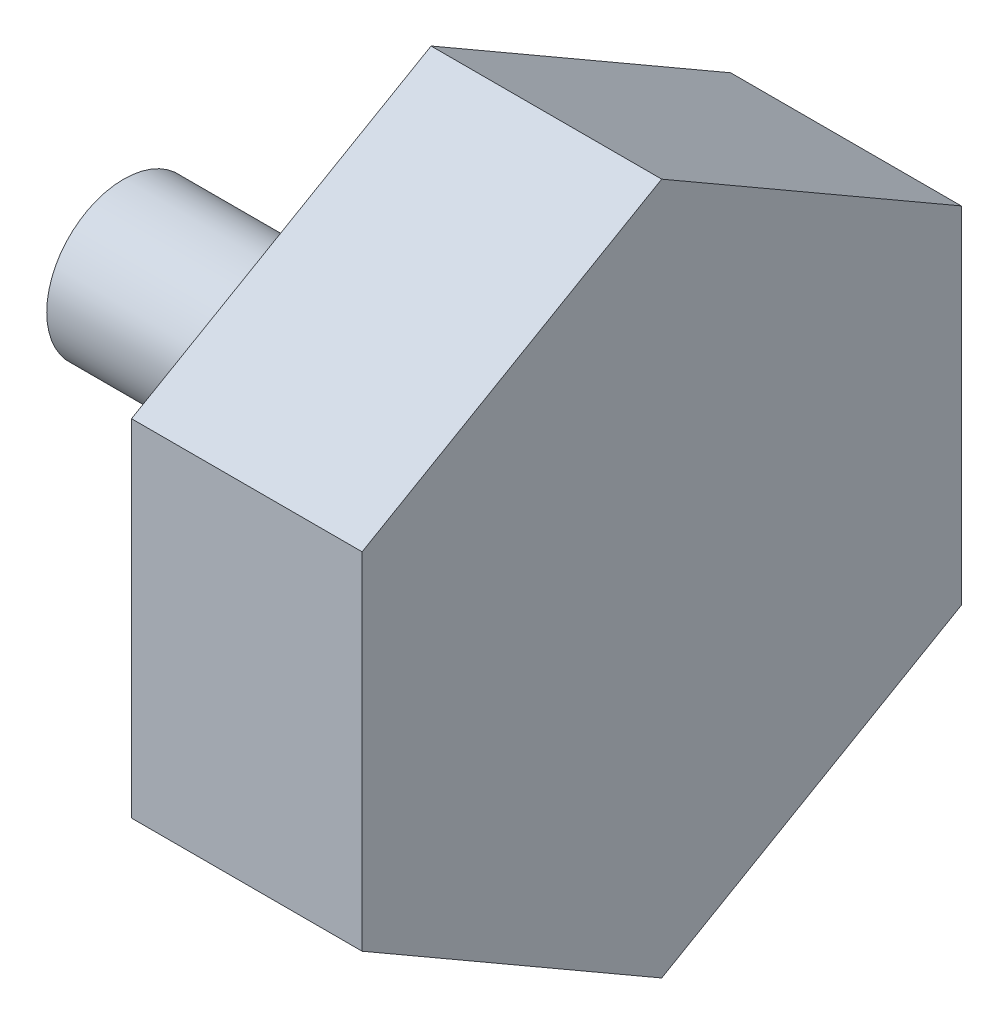
ISO-10303-21;
HEADER;
FILE_DESCRIPTION(('STEP AP214'),'2;1');
FILE_NAME('part.step','',(''),(''),'','','');
FILE_SCHEMA(('AUTOMOTIVE_DESIGN { 1 0 10303 214 1 1 1 1 }'));
ENDSEC;
DATA;
#1=APPLICATION_CONTEXT('core data for automotive mechanical design processes');
#2=APPLICATION_PROTOCOL_DEFINITION('international standard','automotive_design',2000,#1);
#3=PRODUCT_CONTEXT('',#1,'mechanical');
#4=PRODUCT('Part','Part','',(#3));
#5=PRODUCT_RELATED_PRODUCT_CATEGORY('part','',(#4));
#6=PRODUCT_DEFINITION_FORMATION('','',#4);
#7=PRODUCT_DEFINITION_CONTEXT('part definition',#1,'design');
#8=PRODUCT_DEFINITION('design','',#6,#7);
#9=PRODUCT_DEFINITION_SHAPE('','',#8);
#10=(LENGTH_UNIT() NAMED_UNIT(*) SI_UNIT(.MILLI.,.METRE.));
#11=(NAMED_UNIT(*) PLANE_ANGLE_UNIT() SI_UNIT($,.RADIAN.));
#12=(NAMED_UNIT(*) SI_UNIT($,.STERADIAN.) SOLID_ANGLE_UNIT());
#13=UNCERTAINTY_MEASURE_WITH_UNIT(LENGTH_MEASURE(1.E-05),#10,'distance_accuracy_value','');
#14=(GEOMETRIC_REPRESENTATION_CONTEXT(3) GLOBAL_UNCERTAINTY_ASSIGNED_CONTEXT((#13)) GLOBAL_UNIT_ASSIGNED_CONTEXT((#10,
#11,#12)) REPRESENTATION_CONTEXT('',''));
#15=CARTESIAN_POINT('',(0.,0.,0.));
#16=DIRECTION('',(0.,0.,1.));
#17=DIRECTION('',(1.,0.,0.));
#18=AXIS2_PLACEMENT_3D('',#15,#16,#17);
#19=CARTESIAN_POINT('',(6.,-4.50000000000008,7.79422863405988));
#20=DIRECTION('',(0.,0.866025403784442,-0.499999999999995));
#21=DIRECTION('',(0.,0.499999999999995,0.866025403784442));
#22=AXIS2_PLACEMENT_3D('',#19,#20,#21);
#23=PLANE('',#22);
#24=DIRECTION('',(0.,-0.499999999999995,-0.866025403784441));
#25=VECTOR('',#24,1.);
#26=CARTESIAN_POINT('',(0.,-4.50000000000008,7.79422863405988));
#27=LINE('',#26,#25);
#28=CARTESIAN_POINT('',(0.,-4.50000000000008,7.79422863405988));
#29=VERTEX_POINT('',#28);
#30=CARTESIAN_POINT('',(0.,-8.99999999999998,0.));
#31=VERTEX_POINT('',#30);
#32=EDGE_CURVE('E121',#29,#31,#27,.T.);
#33=ORIENTED_EDGE('',*,*,#32,.T.);
#34=DIRECTION('',(-1.,0.,0.));
#35=VECTOR('',#34,1.);
#36=CARTESIAN_POINT('',(6.,-8.99999999999998,0.));
#37=LINE('',#36,#35);
#38=CARTESIAN_POINT('',(6.,-8.99999999999998,0.));
#39=VERTEX_POINT('',#38);
#40=EDGE_CURVE('E44',#39,#31,#37,.T.);
#41=ORIENTED_EDGE('',*,*,#40,.F.);
#42=DIRECTION('',(0.,-0.499999999999995,-0.866025403784441));
#43=VECTOR('',#42,1.);
#44=CARTESIAN_POINT('',(6.,-4.50000000000008,7.79422863405988));
#45=LINE('',#44,#43);
#46=CARTESIAN_POINT('',(6.,-4.50000000000008,7.79422863405988));
#47=VERTEX_POINT('',#46);
#48=EDGE_CURVE('E132',#47,#39,#45,.T.);
#49=ORIENTED_EDGE('',*,*,#48,.F.);
#50=DIRECTION('',(-1.,0.,0.));
#51=VECTOR('',#50,1.);
#52=CARTESIAN_POINT('',(6.,-4.50000000000008,7.79422863405988));
#53=LINE('',#52,#51);
#54=EDGE_CURVE('E117',#47,#29,#53,.T.);
#55=ORIENTED_EDGE('',*,*,#54,.T.);
#56=EDGE_LOOP('',(#33,#41,#49,#55));
#57=FACE_BOUND('',#56,.T.);
#58=ADVANCED_FACE('F36',(#57),#23,.F.);
#59=CARTESIAN_POINT('',(6.,-8.99999999999998,0.));
#60=DIRECTION('',(0.,0.866025403784438,0.500000000000001));
#61=DIRECTION('',(0.,-0.500000000000001,0.866025403784438));
#62=AXIS2_PLACEMENT_3D('',#59,#60,#61);
#63=PLANE('',#62);
#64=DIRECTION('',(0.,0.500000000000001,-0.866025403784438));
#65=VECTOR('',#64,1.);
#66=CARTESIAN_POINT('',(0.,-8.99999999999998,0.));
#67=LINE('',#66,#65);
#68=CARTESIAN_POINT('',(0.,-4.49999999999997,-7.79422863405994));
#69=VERTEX_POINT('',#68);
#70=EDGE_CURVE('E124',#31,#69,#67,.T.);
#71=ORIENTED_EDGE('',*,*,#70,.T.);
#72=DIRECTION('',(-1.,0.,0.));
#73=VECTOR('',#72,1.);
#74=CARTESIAN_POINT('',(6.,-4.49999999999997,-7.79422863405994));
#75=LINE('',#74,#73);
#76=CARTESIAN_POINT('',(6.,-4.49999999999997,-7.79422863405994));
#77=VERTEX_POINT('',#76);
#78=EDGE_CURVE('E136',#77,#69,#75,.T.);
#79=ORIENTED_EDGE('',*,*,#78,.F.);
#80=DIRECTION('',(0.,0.500000000000001,-0.866025403784438));
#81=VECTOR('',#80,1.);
#82=CARTESIAN_POINT('',(6.,-8.99999999999998,0.));
#83=LINE('',#82,#81);
#84=EDGE_CURVE('E90',#39,#77,#83,.T.);
#85=ORIENTED_EDGE('',*,*,#84,.F.);
#86=ORIENTED_EDGE('',*,*,#40,.T.);
#87=EDGE_LOOP('',(#71,#79,#85,#86));
#88=FACE_BOUND('',#87,.T.);
#89=ADVANCED_FACE('F139',(#88),#63,.F.);
#90=CARTESIAN_POINT('',(6.,-4.49999999999997,-7.79422863405994));
#91=DIRECTION('',(0.,0.,1.));
#92=DIRECTION('',(0.,-1.,0.));
#93=AXIS2_PLACEMENT_3D('',#90,#91,#92);
#94=PLANE('',#93);
#95=DIRECTION('',(0.,1.,0.));
#96=VECTOR('',#95,1.);
#97=CARTESIAN_POINT('',(0.,-4.49999999999997,-7.79422863405994));
#98=LINE('',#97,#96);
#99=CARTESIAN_POINT('',(0.,4.50000000000003,-7.79422863405991));
#100=VERTEX_POINT('',#99);
#101=EDGE_CURVE('E127',#69,#100,#98,.T.);
#102=ORIENTED_EDGE('',*,*,#101,.T.);
#103=DIRECTION('',(-1.,0.,0.));
#104=VECTOR('',#103,1.);
#105=CARTESIAN_POINT('',(6.,4.50000000000003,-7.79422863405991));
#106=LINE('',#105,#104);
#107=CARTESIAN_POINT('',(6.,4.50000000000003,-7.79422863405991));
#108=VERTEX_POINT('',#107);
#109=EDGE_CURVE('E112',#108,#100,#106,.T.);
#110=ORIENTED_EDGE('',*,*,#109,.F.);
#111=DIRECTION('',(0.,1.,0.));
#112=VECTOR('',#111,1.);
#113=CARTESIAN_POINT('',(6.,-4.49999999999997,-7.79422863405994));
#114=LINE('',#113,#112);
#115=EDGE_CURVE('E103',#77,#108,#114,.T.);
#116=ORIENTED_EDGE('',*,*,#115,.F.);
#117=ORIENTED_EDGE('',*,*,#78,.T.);
#118=EDGE_LOOP('',(#102,#110,#116,#117));
#119=FACE_BOUND('',#118,.T.);
#120=ADVANCED_FACE('F147',(#119),#94,.F.);
#121=CARTESIAN_POINT('',(6.,4.50000000000003,-7.79422863405991));
#122=DIRECTION('',(0.,-0.866025403784442,0.499999999999995));
#123=DIRECTION('',(0.,-0.499999999999995,-0.866025403784442));
#124=AXIS2_PLACEMENT_3D('',#121,#122,#123);
#125=PLANE('',#124);
#126=DIRECTION('',(0.,0.499999999999995,0.866025403784441));
#127=VECTOR('',#126,1.);
#128=CARTESIAN_POINT('',(0.,4.50000000000003,-7.79422863405991));
#129=LINE('',#128,#127);
#130=CARTESIAN_POINT('',(0.,8.99999999999998,0.));
#131=VERTEX_POINT('',#130);
#132=EDGE_CURVE('E111',#100,#131,#129,.T.);
#133=ORIENTED_EDGE('',*,*,#132,.T.);
#134=DIRECTION('',(-1.,0.,0.));
#135=VECTOR('',#134,1.);
#136=CARTESIAN_POINT('',(6.,8.99999999999998,0.));
#137=LINE('',#136,#135);
#138=CARTESIAN_POINT('',(6.,8.99999999999998,0.));
#139=VERTEX_POINT('',#138);
#140=EDGE_CURVE('E108',#139,#131,#137,.T.);
#141=ORIENTED_EDGE('',*,*,#140,.F.);
#142=DIRECTION('',(0.,0.499999999999995,0.866025403784441));
#143=VECTOR('',#142,1.);
#144=CARTESIAN_POINT('',(6.,4.50000000000003,-7.79422863405991));
#145=LINE('',#144,#143);
#146=EDGE_CURVE('E97',#108,#139,#145,.T.);
#147=ORIENTED_EDGE('',*,*,#146,.F.);
#148=ORIENTED_EDGE('',*,*,#109,.T.);
#149=EDGE_LOOP('',(#133,#141,#147,#148));
#150=FACE_BOUND('',#149,.T.);
#151=ADVANCED_FACE('F109',(#150),#125,.F.);
#152=CARTESIAN_POINT('',(6.,8.99999999999998,0.));
#153=DIRECTION('',(0.,-0.866025403784434,-0.500000000000007));
#154=DIRECTION('',(0.,0.500000000000007,-0.866025403784435));
#155=AXIS2_PLACEMENT_3D('',#152,#153,#154);
#156=PLANE('',#155);
#157=DIRECTION('',(0.,-0.500000000000007,0.866025403784435));
#158=VECTOR('',#157,1.);
#159=CARTESIAN_POINT('',(0.,8.99999999999998,0.));
#160=LINE('',#159,#158);
#161=CARTESIAN_POINT('',(0.,4.49999999999992,7.79422863405997));
#162=VERTEX_POINT('',#161);
#163=EDGE_CURVE('E75',#131,#162,#160,.T.);
#164=ORIENTED_EDGE('',*,*,#163,.T.);
#165=DIRECTION('',(-1.,0.,0.));
#166=VECTOR('',#165,1.);
#167=CARTESIAN_POINT('',(6.,4.49999999999992,7.79422863405997));
#168=LINE('',#167,#166);
#169=CARTESIAN_POINT('',(6.,4.49999999999992,7.79422863405997));
#170=VERTEX_POINT('',#169);
#171=EDGE_CURVE('E113',#170,#162,#168,.T.);
#172=ORIENTED_EDGE('',*,*,#171,.F.);
#173=DIRECTION('',(0.,-0.500000000000007,0.866025403784435));
#174=VECTOR('',#173,1.);
#175=CARTESIAN_POINT('',(6.,8.99999999999998,0.));
#176=LINE('',#175,#174);
#177=EDGE_CURVE('E101',#139,#170,#176,.T.);
#178=ORIENTED_EDGE('',*,*,#177,.F.);
#179=ORIENTED_EDGE('',*,*,#140,.T.);
#180=EDGE_LOOP('',(#164,#172,#178,#179));
#181=FACE_BOUND('',#180,.T.);
#182=ADVANCED_FACE('F115',(#181),#156,.F.);
#183=CARTESIAN_POINT('',(6.,4.49999999999992,7.79422863405997));
#184=DIRECTION('',(0.,0.,-1.));
#185=DIRECTION('',(0.,1.,0.));
#186=AXIS2_PLACEMENT_3D('',#183,#184,#185);
#187=PLANE('',#186);
#188=DIRECTION('',(0.,-1.,0.));
#189=VECTOR('',#188,1.);
#190=CARTESIAN_POINT('',(0.,4.49999999999992,7.79422863405997));
#191=LINE('',#190,#189);
#192=EDGE_CURVE('E81',#162,#29,#191,.T.);
#193=ORIENTED_EDGE('',*,*,#192,.T.);
#194=ORIENTED_EDGE('',*,*,#54,.F.);
#195=DIRECTION('',(0.,-1.,0.));
#196=VECTOR('',#195,1.);
#197=CARTESIAN_POINT('',(6.,4.49999999999992,7.79422863405997));
#198=LINE('',#197,#196);
#199=EDGE_CURVE('E52',#170,#47,#198,.T.);
#200=ORIENTED_EDGE('',*,*,#199,.F.);
#201=ORIENTED_EDGE('',*,*,#171,.T.);
#202=EDGE_LOOP('',(#193,#194,#200,#201));
#203=FACE_BOUND('',#202,.T.);
#204=ADVANCED_FACE('F167',(#203),#187,.F.);
#205=CARTESIAN_POINT('',(6.,0.,0.));
#206=DIRECTION('',(1.,0.,0.));
#207=DIRECTION('',(0.,0.,-1.));
#208=AXIS2_PLACEMENT_3D('',#205,#206,#207);
#209=PLANE('',#208);
#210=ORIENTED_EDGE('',*,*,#48,.T.);
#211=ORIENTED_EDGE('',*,*,#84,.T.);
#212=ORIENTED_EDGE('',*,*,#115,.T.);
#213=ORIENTED_EDGE('',*,*,#146,.T.);
#214=ORIENTED_EDGE('',*,*,#177,.T.);
#215=ORIENTED_EDGE('',*,*,#199,.T.);
#216=EDGE_LOOP('',(#210,#211,#212,#213,#214,#215));
#217=FACE_BOUND('',#216,.T.);
#218=ADVANCED_FACE('F99',(#217),#209,.T.);
#219=CARTESIAN_POINT('',(0.,0.,0.));
#220=DIRECTION('',(1.,0.,0.));
#221=DIRECTION('',(0.,0.,-1.));
#222=AXIS2_PLACEMENT_3D('',#219,#220,#221);
#223=PLANE('',#222);
#224=CARTESIAN_POINT('',(0.,0.,0.));
#225=DIRECTION('',(1.,0.,0.));
#226=DIRECTION('',(0.,0.,-1.));
#227=AXIS2_PLACEMENT_3D('',#224,#225,#226);
#228=CIRCLE('',#227,2.);
#229=CARTESIAN_POINT('',(0.,0.,-2.));
#230=VERTEX_POINT('',#229);
#231=EDGE_CURVE('E11',#230,#230,#228,.F.);
#232=ORIENTED_EDGE('',*,*,#231,.F.);
#233=EDGE_LOOP('',(#232));
#234=FACE_BOUND('',#233,.T.);
#235=ORIENTED_EDGE('',*,*,#32,.F.);
#236=ORIENTED_EDGE('',*,*,#192,.F.);
#237=ORIENTED_EDGE('',*,*,#163,.F.);
#238=ORIENTED_EDGE('',*,*,#132,.F.);
#239=ORIENTED_EDGE('',*,*,#101,.F.);
#240=ORIENTED_EDGE('',*,*,#70,.F.);
#241=EDGE_LOOP('',(#235,#236,#237,#238,#239,#240));
#242=FACE_BOUND('',#241,.T.);
#243=ADVANCED_FACE('F144',(#234,#242),#223,.F.);
#244=CARTESIAN_POINT('',(-8.,0.,0.));
#245=DIRECTION('',(1.,0.,0.));
#246=DIRECTION('',(0.,0.,-1.));
#247=AXIS2_PLACEMENT_3D('',#244,#245,#246);
#248=CYLINDRICAL_SURFACE('',#247,2.);
#249=CARTESIAN_POINT('',(-8.,0.,0.));
#250=DIRECTION('',(-1.,0.,0.));
#251=DIRECTION('',(0.,0.,1.));
#252=AXIS2_PLACEMENT_3D('',#249,#250,#251);
#253=CIRCLE('',#252,2.);
#254=CARTESIAN_POINT('',(-8.,0.,2.));
#255=VERTEX_POINT('',#254);
#256=EDGE_CURVE('E125',#255,#255,#253,.T.);
#257=ORIENTED_EDGE('',*,*,#256,.F.);
#258=EDGE_LOOP('',(#257));
#259=FACE_BOUND('',#258,.T.);
#260=ORIENTED_EDGE('',*,*,#231,.T.);
#261=EDGE_LOOP('',(#260));
#262=FACE_BOUND('',#261,.T.);
#263=ADVANCED_FACE('F156',(#259,#262),#248,.T.);
#264=CARTESIAN_POINT('',(-8.,0.,0.));
#265=DIRECTION('',(-1.,0.,0.));
#266=DIRECTION('',(0.,0.,1.));
#267=AXIS2_PLACEMENT_3D('',#264,#265,#266);
#268=PLANE('',#267);
#269=ORIENTED_EDGE('',*,*,#256,.T.);
#270=EDGE_LOOP('',(#269));
#271=FACE_BOUND('',#270,.T.);
#272=ADVANCED_FACE('F154',(#271),#268,.T.);
#273=CLOSED_SHELL('',(#58,#89,#120,#151,#182,#204,#218,#243,#263,#272));
#274=MANIFOLD_SOLID_BREP('B2',#273);
#275=ADVANCED_BREP_SHAPE_REPRESENTATION('',(#18,#274),#14);
#276=SHAPE_DEFINITION_REPRESENTATION(#9,#275);
ENDSEC;
END-ISO-10303-21;
